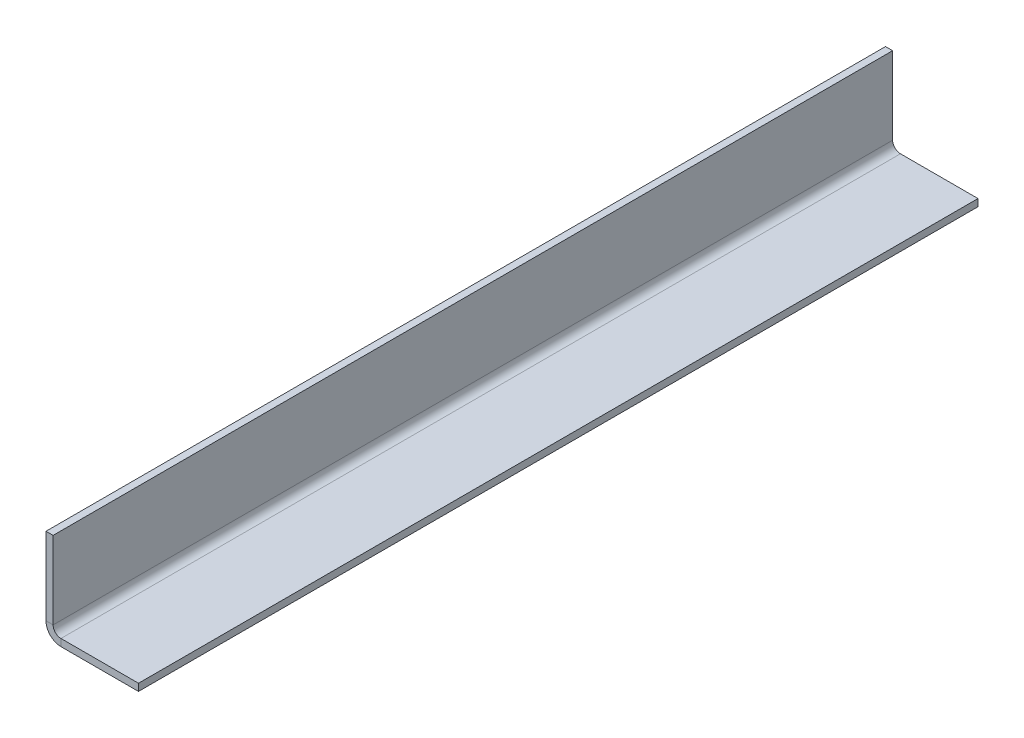
ISO-10303-21;
HEADER;
FILE_DESCRIPTION(('STEP AP214'),'2;1');
FILE_NAME('part.step','',(''),(''),'','','');
FILE_SCHEMA(('AUTOMOTIVE_DESIGN { 1 0 10303 214 1 1 1 1 }'));
ENDSEC;
DATA;
#1=APPLICATION_CONTEXT('core data for automotive mechanical design processes');
#2=APPLICATION_PROTOCOL_DEFINITION('international standard','automotive_design',2000,#1);
#3=PRODUCT_CONTEXT('',#1,'mechanical');
#4=PRODUCT('Part','Part','',(#3));
#5=PRODUCT_RELATED_PRODUCT_CATEGORY('part','',(#4));
#6=PRODUCT_DEFINITION_FORMATION('','',#4);
#7=PRODUCT_DEFINITION_CONTEXT('part definition',#1,'design');
#8=PRODUCT_DEFINITION('design','',#6,#7);
#9=PRODUCT_DEFINITION_SHAPE('','',#8);
#10=(LENGTH_UNIT() NAMED_UNIT(*) SI_UNIT(.MILLI.,.METRE.));
#11=(NAMED_UNIT(*) PLANE_ANGLE_UNIT() SI_UNIT($,.RADIAN.));
#12=(NAMED_UNIT(*) SI_UNIT($,.STERADIAN.) SOLID_ANGLE_UNIT());
#13=UNCERTAINTY_MEASURE_WITH_UNIT(LENGTH_MEASURE(1.E-05),#10,'distance_accuracy_value','');
#14=(GEOMETRIC_REPRESENTATION_CONTEXT(3) GLOBAL_UNCERTAINTY_ASSIGNED_CONTEXT((#13)) GLOBAL_UNIT_ASSIGNED_CONTEXT((#10,
#11,#12)) REPRESENTATION_CONTEXT('',''));
#15=CARTESIAN_POINT('',(0.,0.,0.));
#16=DIRECTION('',(0.,0.,1.));
#17=DIRECTION('',(1.,0.,0.));
#18=AXIS2_PLACEMENT_3D('',#15,#16,#17);
#19=CARTESIAN_POINT('',(-25.7928740128807,0.,118.));
#20=DIRECTION('',(0.,0.,1.));
#21=DIRECTION('',(1.,0.,0.));
#22=AXIS2_PLACEMENT_3D('',#19,#20,#21);
#23=PLANE('',#22);
#24=DIRECTION('',(0.,-1.,0.));
#25=VECTOR('',#24,1.);
#26=CARTESIAN_POINT('',(-25.7928740128807,0.,118.));
#27=LINE('',#26,#25);
#28=CARTESIAN_POINT('',(-25.7928740128807,0.,118.));
#29=VERTEX_POINT('',#28);
#30=CARTESIAN_POINT('',(-25.7928740128807,-1.,118.));
#31=VERTEX_POINT('',#30);
#32=EDGE_CURVE('E11',#29,#31,#27,.T.);
#33=ORIENTED_EDGE('',*,*,#32,.F.);
#34=CARTESIAN_POINT('',(-25.7928740128807,1.1,118.));
#35=DIRECTION('',(0.,0.,-1.));
#36=DIRECTION('',(-1.,0.,0.));
#37=AXIS2_PLACEMENT_3D('',#34,#35,#36);
#38=CIRCLE('',#37,1.1);
#39=CARTESIAN_POINT('',(-26.8928740128807,1.1,118.));
#40=VERTEX_POINT('',#39);
#41=EDGE_CURVE('E132',#40,#29,#38,.F.);
#42=ORIENTED_EDGE('',*,*,#41,.F.);
#43=DIRECTION('',(1.,0.,0.));
#44=VECTOR('',#43,1.);
#45=CARTESIAN_POINT('',(-27.8928740128807,1.1,118.));
#46=LINE('',#45,#44);
#47=CARTESIAN_POINT('',(-27.8928740128807,1.1,118.));
#48=VERTEX_POINT('',#47);
#49=EDGE_CURVE('E43',#48,#40,#46,.T.);
#50=ORIENTED_EDGE('',*,*,#49,.F.);
#51=CARTESIAN_POINT('',(-25.7928740128807,1.1,118.));
#52=DIRECTION('',(0.,0.,1.));
#53=DIRECTION('',(1.,0.,0.));
#54=AXIS2_PLACEMENT_3D('',#51,#52,#53);
#55=CIRCLE('',#54,2.1);
#56=EDGE_CURVE('E125',#48,#31,#55,.T.);
#57=ORIENTED_EDGE('',*,*,#56,.T.);
#58=EDGE_LOOP('',(#33,#42,#50,#57));
#59=FACE_BOUND('',#58,.T.);
#60=ADVANCED_FACE('F35',(#59),#23,.T.);
#61=CARTESIAN_POINT('',(-27.8928740128807,1.1,118.));
#62=DIRECTION('',(0.,0.,1.));
#63=DIRECTION('',(1.,0.,0.));
#64=AXIS2_PLACEMENT_3D('',#61,#62,#63);
#65=PLANE('',#64);
#66=DIRECTION('',(1.,0.,0.));
#67=VECTOR('',#66,1.);
#68=CARTESIAN_POINT('',(-26.8928740128807,0.,118.));
#69=LINE('',#68,#67);
#70=CARTESIAN_POINT('',(-14.8928740128807,0.,118.));
#71=VERTEX_POINT('',#70);
#72=EDGE_CURVE('E181',#29,#71,#69,.T.);
#73=ORIENTED_EDGE('',*,*,#72,.F.);
#74=ORIENTED_EDGE('',*,*,#32,.T.);
#75=DIRECTION('',(1.,0.,0.));
#76=VECTOR('',#75,1.);
#77=CARTESIAN_POINT('',(-26.8928740128807,-1.,118.));
#78=LINE('',#77,#76);
#79=CARTESIAN_POINT('',(-14.8928740128807,-1.,118.));
#80=VERTEX_POINT('',#79);
#81=EDGE_CURVE('E91',#31,#80,#78,.T.);
#82=ORIENTED_EDGE('',*,*,#81,.T.);
#83=DIRECTION('',(0.,-1.,0.));
#84=VECTOR('',#83,1.);
#85=CARTESIAN_POINT('',(-14.8928740128807,0.,118.));
#86=LINE('',#85,#84);
#87=EDGE_CURVE('E338',#71,#80,#86,.T.);
#88=ORIENTED_EDGE('',*,*,#87,.F.);
#89=EDGE_LOOP('',(#73,#74,#82,#88));
#90=FACE_BOUND('',#89,.T.);
#91=ADVANCED_FACE('F189',(#90),#65,.T.);
#92=CARTESIAN_POINT('',(-26.8928740128807,1.1,0.));
#93=DIRECTION('',(0.,0.,-1.));
#94=DIRECTION('',(-1.,0.,0.));
#95=AXIS2_PLACEMENT_3D('',#92,#93,#94);
#96=PLANE('',#95);
#97=DIRECTION('',(-1.,0.,0.));
#98=VECTOR('',#97,1.);
#99=CARTESIAN_POINT('',(-26.8928740128807,1.1,0.));
#100=LINE('',#99,#98);
#101=CARTESIAN_POINT('',(-26.8928740128807,1.1,0.));
#102=VERTEX_POINT('',#101);
#103=CARTESIAN_POINT('',(-27.8928740128807,1.1,0.));
#104=VERTEX_POINT('',#103);
#105=EDGE_CURVE('E78',#102,#104,#100,.T.);
#106=ORIENTED_EDGE('',*,*,#105,.F.);
#107=CARTESIAN_POINT('',(-25.7928740128807,1.1,0.));
#108=DIRECTION('',(0.,0.,-1.));
#109=DIRECTION('',(-1.,0.,0.));
#110=AXIS2_PLACEMENT_3D('',#107,#108,#109);
#111=CIRCLE('',#110,1.1);
#112=CARTESIAN_POINT('',(-25.7928740128807,0.,0.));
#113=VERTEX_POINT('',#112);
#114=EDGE_CURVE('E147',#102,#113,#111,.F.);
#115=ORIENTED_EDGE('',*,*,#114,.T.);
#116=DIRECTION('',(0.,1.,0.));
#117=VECTOR('',#116,1.);
#118=CARTESIAN_POINT('',(-25.7928740128807,-1.,0.));
#119=LINE('',#118,#117);
#120=CARTESIAN_POINT('',(-25.7928740128807,-1.,0.));
#121=VERTEX_POINT('',#120);
#122=EDGE_CURVE('E85',#121,#113,#119,.T.);
#123=ORIENTED_EDGE('',*,*,#122,.F.);
#124=CARTESIAN_POINT('',(-25.7928740128807,1.1,0.));
#125=DIRECTION('',(0.,0.,1.));
#126=DIRECTION('',(1.,0.,0.));
#127=AXIS2_PLACEMENT_3D('',#124,#125,#126);
#128=CIRCLE('',#127,2.1);
#129=EDGE_CURVE('E154',#104,#121,#128,.T.);
#130=ORIENTED_EDGE('',*,*,#129,.F.);
#131=EDGE_LOOP('',(#106,#115,#123,#130));
#132=FACE_BOUND('',#131,.T.);
#133=ADVANCED_FACE('F187',(#132),#96,.T.);
#134=CARTESIAN_POINT('',(-25.7928740128807,-1.,0.));
#135=DIRECTION('',(0.,0.,-1.));
#136=DIRECTION('',(-1.,0.,0.));
#137=AXIS2_PLACEMENT_3D('',#134,#135,#136);
#138=PLANE('',#137);
#139=DIRECTION('',(0.,-1.,0.));
#140=VECTOR('',#139,1.);
#141=CARTESIAN_POINT('',(-26.8928740128807,12.,0.));
#142=LINE('',#141,#140);
#143=CARTESIAN_POINT('',(-26.8928740128807,12.,0.));
#144=VERTEX_POINT('',#143);
#145=EDGE_CURVE('E149',#144,#102,#142,.T.);
#146=ORIENTED_EDGE('',*,*,#145,.T.);
#147=ORIENTED_EDGE('',*,*,#105,.T.);
#148=DIRECTION('',(0.,-1.,0.));
#149=VECTOR('',#148,1.);
#150=CARTESIAN_POINT('',(-27.8928740128807,12.,0.));
#151=LINE('',#150,#149);
#152=CARTESIAN_POINT('',(-27.8928740128807,12.,0.));
#153=VERTEX_POINT('',#152);
#154=EDGE_CURVE('E152',#153,#104,#151,.T.);
#155=ORIENTED_EDGE('',*,*,#154,.F.);
#156=DIRECTION('',(1.,0.,0.));
#157=VECTOR('',#156,1.);
#158=CARTESIAN_POINT('',(-27.8928740128807,12.,0.));
#159=LINE('',#158,#157);
#160=EDGE_CURVE('E113',#153,#144,#159,.T.);
#161=ORIENTED_EDGE('',*,*,#160,.T.);
#162=EDGE_LOOP('',(#146,#147,#155,#161));
#163=FACE_BOUND('',#162,.T.);
#164=ADVANCED_FACE('F183',(#163),#138,.T.);
#165=CARTESIAN_POINT('',(-26.8928740128807,-1.,118.));
#166=DIRECTION('',(0.,1.,0.));
#167=DIRECTION('',(0.,0.,1.));
#168=AXIS2_PLACEMENT_3D('',#165,#166,#167);
#169=PLANE('',#168);
#170=DIRECTION('',(1.,0.,0.));
#171=VECTOR('',#170,1.);
#172=CARTESIAN_POINT('',(-26.8928740128807,-1.,0.));
#173=LINE('',#172,#171);
#174=CARTESIAN_POINT('',(-14.8928740128807,-1.,0.));
#175=VERTEX_POINT('',#174);
#176=EDGE_CURVE('E138',#121,#175,#173,.T.);
#177=ORIENTED_EDGE('',*,*,#176,.T.);
#178=DIRECTION('',(0.,0.,-1.));
#179=VECTOR('',#178,1.);
#180=CARTESIAN_POINT('',(-14.8928740128807,-1.,118.));
#181=LINE('',#180,#179);
#182=EDGE_CURVE('E168',#80,#175,#181,.T.);
#183=ORIENTED_EDGE('',*,*,#182,.F.);
#184=ORIENTED_EDGE('',*,*,#81,.F.);
#185=DIRECTION('',(0.,0.,-1.));
#186=VECTOR('',#185,1.);
#187=CARTESIAN_POINT('',(-25.7928740128807,-1.,118.));
#188=LINE('',#187,#186);
#189=EDGE_CURVE('E137',#31,#121,#188,.T.);
#190=ORIENTED_EDGE('',*,*,#189,.T.);
#191=EDGE_LOOP('',(#177,#183,#184,#190));
#192=FACE_BOUND('',#191,.T.);
#193=ADVANCED_FACE('F195',(#192),#169,.F.);
#194=CARTESIAN_POINT('',(-14.8928740128807,0.,118.));
#195=DIRECTION('',(1.,0.,0.));
#196=DIRECTION('',(0.,0.,-1.));
#197=AXIS2_PLACEMENT_3D('',#194,#195,#196);
#198=PLANE('',#197);
#199=DIRECTION('',(0.,-1.,0.));
#200=VECTOR('',#199,1.);
#201=CARTESIAN_POINT('',(-14.8928740128807,0.,0.));
#202=LINE('',#201,#200);
#203=CARTESIAN_POINT('',(-14.8928740128807,0.,0.));
#204=VERTEX_POINT('',#203);
#205=EDGE_CURVE('E141',#204,#175,#202,.T.);
#206=ORIENTED_EDGE('',*,*,#205,.F.);
#207=DIRECTION('',(0.,0.,-1.));
#208=VECTOR('',#207,1.);
#209=CARTESIAN_POINT('',(-14.8928740128807,0.,118.));
#210=LINE('',#209,#208);
#211=EDGE_CURVE('E166',#71,#204,#210,.T.);
#212=ORIENTED_EDGE('',*,*,#211,.F.);
#213=ORIENTED_EDGE('',*,*,#87,.T.);
#214=ORIENTED_EDGE('',*,*,#182,.T.);
#215=EDGE_LOOP('',(#206,#212,#213,#214));
#216=FACE_BOUND('',#215,.T.);
#217=ADVANCED_FACE('F226',(#216),#198,.T.);
#218=CARTESIAN_POINT('',(-26.8928740128807,0.,118.));
#219=DIRECTION('',(0.,1.,0.));
#220=DIRECTION('',(0.,0.,1.));
#221=AXIS2_PLACEMENT_3D('',#218,#219,#220);
#222=PLANE('',#221);
#223=DIRECTION('',(1.,0.,0.));
#224=VECTOR('',#223,1.);
#225=CARTESIAN_POINT('',(-26.8928740128807,0.,0.));
#226=LINE('',#225,#224);
#227=EDGE_CURVE('E144',#113,#204,#226,.T.);
#228=ORIENTED_EDGE('',*,*,#227,.F.);
#229=DIRECTION('',(0.,0.,-1.));
#230=VECTOR('',#229,1.);
#231=CARTESIAN_POINT('',(-25.7928740128807,0.,118.));
#232=LINE('',#231,#230);
#233=EDGE_CURVE('E163',#29,#113,#232,.T.);
#234=ORIENTED_EDGE('',*,*,#233,.F.);
#235=ORIENTED_EDGE('',*,*,#72,.T.);
#236=ORIENTED_EDGE('',*,*,#211,.T.);
#237=EDGE_LOOP('',(#228,#234,#235,#236));
#238=FACE_BOUND('',#237,.T.);
#239=ADVANCED_FACE('F237',(#238),#222,.T.);
#240=CARTESIAN_POINT('',(-25.7928740128807,1.1,118.));
#241=DIRECTION('',(0.,0.,-1.));
#242=DIRECTION('',(-1.,0.,0.));
#243=AXIS2_PLACEMENT_3D('',#240,#241,#242);
#244=CYLINDRICAL_SURFACE('',#243,1.1);
#245=ORIENTED_EDGE('',*,*,#114,.F.);
#246=DIRECTION('',(0.,0.,-1.));
#247=VECTOR('',#246,1.);
#248=CARTESIAN_POINT('',(-26.8928740128807,1.1,118.));
#249=LINE('',#248,#247);
#250=EDGE_CURVE('E160',#40,#102,#249,.T.);
#251=ORIENTED_EDGE('',*,*,#250,.F.);
#252=ORIENTED_EDGE('',*,*,#41,.T.);
#253=ORIENTED_EDGE('',*,*,#233,.T.);
#254=EDGE_LOOP('',(#245,#251,#252,#253));
#255=FACE_BOUND('',#254,.T.);
#256=ADVANCED_FACE('F177',(#255),#244,.F.);
#257=CARTESIAN_POINT('',(-26.8928740128807,12.,118.));
#258=DIRECTION('',(1.,0.,0.));
#259=DIRECTION('',(0.,1.,0.));
#260=AXIS2_PLACEMENT_3D('',#257,#258,#259);
#261=PLANE('',#260);
#262=ORIENTED_EDGE('',*,*,#145,.F.);
#263=DIRECTION('',(0.,0.,-1.));
#264=VECTOR('',#263,1.);
#265=CARTESIAN_POINT('',(-26.8928740128807,12.,118.));
#266=LINE('',#265,#264);
#267=CARTESIAN_POINT('',(-26.8928740128807,12.,118.));
#268=VERTEX_POINT('',#267);
#269=EDGE_CURVE('E115',#268,#144,#266,.T.);
#270=ORIENTED_EDGE('',*,*,#269,.F.);
#271=DIRECTION('',(0.,-1.,0.));
#272=VECTOR('',#271,1.);
#273=CARTESIAN_POINT('',(-26.8928740128807,12.,118.));
#274=LINE('',#273,#272);
#275=EDGE_CURVE('E130',#268,#40,#274,.T.);
#276=ORIENTED_EDGE('',*,*,#275,.T.);
#277=ORIENTED_EDGE('',*,*,#250,.T.);
#278=EDGE_LOOP('',(#262,#270,#276,#277));
#279=FACE_BOUND('',#278,.T.);
#280=ADVANCED_FACE('F182',(#279),#261,.T.);
#281=CARTESIAN_POINT('',(-27.8928740128807,12.,118.));
#282=DIRECTION('',(0.,1.,0.));
#283=DIRECTION('',(0.,0.,1.));
#284=AXIS2_PLACEMENT_3D('',#281,#282,#283);
#285=PLANE('',#284);
#286=ORIENTED_EDGE('',*,*,#160,.F.);
#287=DIRECTION('',(0.,0.,-1.));
#288=VECTOR('',#287,1.);
#289=CARTESIAN_POINT('',(-27.8928740128807,12.,118.));
#290=LINE('',#289,#288);
#291=CARTESIAN_POINT('',(-27.8928740128807,12.,118.));
#292=VERTEX_POINT('',#291);
#293=EDGE_CURVE('E107',#292,#153,#290,.T.);
#294=ORIENTED_EDGE('',*,*,#293,.F.);
#295=DIRECTION('',(1.,0.,0.));
#296=VECTOR('',#295,1.);
#297=CARTESIAN_POINT('',(-27.8928740128807,12.,118.));
#298=LINE('',#297,#296);
#299=EDGE_CURVE('E111',#292,#268,#298,.T.);
#300=ORIENTED_EDGE('',*,*,#299,.T.);
#301=ORIENTED_EDGE('',*,*,#269,.T.);
#302=EDGE_LOOP('',(#286,#294,#300,#301));
#303=FACE_BOUND('',#302,.T.);
#304=ADVANCED_FACE('F109',(#303),#285,.T.);
#305=CARTESIAN_POINT('',(-27.8928740128807,12.,118.));
#306=DIRECTION('',(1.,0.,0.));
#307=DIRECTION('',(0.,1.,0.));
#308=AXIS2_PLACEMENT_3D('',#305,#306,#307);
#309=PLANE('',#308);
#310=ORIENTED_EDGE('',*,*,#154,.T.);
#311=DIRECTION('',(0.,0.,-1.));
#312=VECTOR('',#311,1.);
#313=CARTESIAN_POINT('',(-27.8928740128807,1.1,118.));
#314=LINE('',#313,#312);
#315=EDGE_CURVE('E116',#48,#104,#314,.T.);
#316=ORIENTED_EDGE('',*,*,#315,.F.);
#317=DIRECTION('',(0.,-1.,0.));
#318=VECTOR('',#317,1.);
#319=CARTESIAN_POINT('',(-27.8928740128807,12.,118.));
#320=LINE('',#319,#318);
#321=EDGE_CURVE('E120',#292,#48,#320,.T.);
#322=ORIENTED_EDGE('',*,*,#321,.F.);
#323=ORIENTED_EDGE('',*,*,#293,.T.);
#324=EDGE_LOOP('',(#310,#316,#322,#323));
#325=FACE_BOUND('',#324,.T.);
#326=ADVANCED_FACE('F121',(#325),#309,.F.);
#327=CARTESIAN_POINT('',(-25.7928740128807,1.1,118.));
#328=DIRECTION('',(0.,0.,-1.));
#329=DIRECTION('',(-1.,0.,0.));
#330=AXIS2_PLACEMENT_3D('',#327,#328,#329);
#331=CYLINDRICAL_SURFACE('',#330,2.1);
#332=ORIENTED_EDGE('',*,*,#129,.T.);
#333=ORIENTED_EDGE('',*,*,#189,.F.);
#334=ORIENTED_EDGE('',*,*,#56,.F.);
#335=ORIENTED_EDGE('',*,*,#315,.T.);
#336=EDGE_LOOP('',(#332,#333,#334,#335));
#337=FACE_BOUND('',#336,.T.);
#338=ADVANCED_FACE('F185',(#337),#331,.T.);
#339=CARTESIAN_POINT('',(-25.7928740128807,1.1,118.));
#340=DIRECTION('',(0.,0.,-1.));
#341=DIRECTION('',(-1.,0.,0.));
#342=AXIS2_PLACEMENT_3D('',#339,#340,#341);
#343=PLANE('',#342);
#344=ORIENTED_EDGE('',*,*,#321,.T.);
#345=ORIENTED_EDGE('',*,*,#49,.T.);
#346=ORIENTED_EDGE('',*,*,#275,.F.);
#347=ORIENTED_EDGE('',*,*,#299,.F.);
#348=EDGE_LOOP('',(#344,#345,#346,#347));
#349=FACE_BOUND('',#348,.T.);
#350=ADVANCED_FACE('F128',(#349),#343,.F.);
#351=CARTESIAN_POINT('',(-25.7928740128807,1.1,0.));
#352=DIRECTION('',(0.,0.,-1.));
#353=DIRECTION('',(-1.,0.,0.));
#354=AXIS2_PLACEMENT_3D('',#351,#352,#353);
#355=PLANE('',#354);
#356=ORIENTED_EDGE('',*,*,#176,.F.);
#357=ORIENTED_EDGE('',*,*,#122,.T.);
#358=ORIENTED_EDGE('',*,*,#227,.T.);
#359=ORIENTED_EDGE('',*,*,#205,.T.);
#360=EDGE_LOOP('',(#356,#357,#358,#359));
#361=FACE_BOUND('',#360,.T.);
#362=ADVANCED_FACE('F303',(#361),#355,.T.);
#363=CLOSED_SHELL('',(#60,#91,#133,#164,#193,#217,#239,#256,#280,#304,#326,#338,#350,#362));
#364=MANIFOLD_SOLID_BREP('B2',#363);
#365=ADVANCED_BREP_SHAPE_REPRESENTATION('',(#18,#364),#14);
#366=SHAPE_DEFINITION_REPRESENTATION(#9,#365);
ENDSEC;
END-ISO-10303-21;
